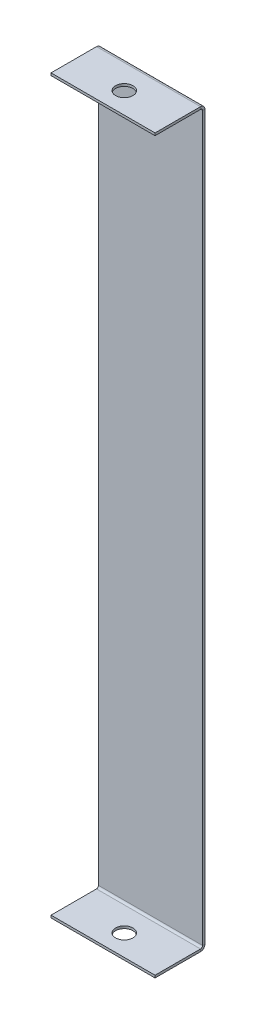
ISO-10303-21;
HEADER;
FILE_DESCRIPTION(('STEP AP214'),'2;1');
FILE_NAME('part.step','',(''),(''),'','','');
FILE_SCHEMA(('AUTOMOTIVE_DESIGN { 1 0 10303 214 1 1 1 1 }'));
ENDSEC;
DATA;
#1=APPLICATION_CONTEXT('core data for automotive mechanical design processes');
#2=APPLICATION_PROTOCOL_DEFINITION('international standard','automotive_design',2000,#1);
#3=PRODUCT_CONTEXT('',#1,'mechanical');
#4=PRODUCT('Part','Part','',(#3));
#5=PRODUCT_RELATED_PRODUCT_CATEGORY('part','',(#4));
#6=PRODUCT_DEFINITION_FORMATION('','',#4);
#7=PRODUCT_DEFINITION_CONTEXT('part definition',#1,'design');
#8=PRODUCT_DEFINITION('design','',#6,#7);
#9=PRODUCT_DEFINITION_SHAPE('','',#8);
#10=(LENGTH_UNIT() NAMED_UNIT(*) SI_UNIT(.MILLI.,.METRE.));
#11=(NAMED_UNIT(*) PLANE_ANGLE_UNIT() SI_UNIT($,.RADIAN.));
#12=(NAMED_UNIT(*) SI_UNIT($,.STERADIAN.) SOLID_ANGLE_UNIT());
#13=UNCERTAINTY_MEASURE_WITH_UNIT(LENGTH_MEASURE(1.E-05),#10,'distance_accuracy_value','');
#14=(GEOMETRIC_REPRESENTATION_CONTEXT(3) GLOBAL_UNCERTAINTY_ASSIGNED_CONTEXT((#13)) GLOBAL_UNIT_ASSIGNED_CONTEXT((#10,
#11,#12)) REPRESENTATION_CONTEXT('',''));
#15=CARTESIAN_POINT('',(0.,0.,0.));
#16=DIRECTION('',(0.,0.,1.));
#17=DIRECTION('',(1.,0.,0.));
#18=AXIS2_PLACEMENT_3D('',#15,#16,#17);
#19=CARTESIAN_POINT('',(0.,0.,-0.889));
#20=DIRECTION('',(0.,0.,-1.));
#21=DIRECTION('',(-1.,0.,0.));
#22=AXIS2_PLACEMENT_3D('',#19,#20,#21);
#23=PLANE('',#22);
#24=DIRECTION('',(0.,1.,0.));
#25=VECTOR('',#24,1.);
#26=CARTESIAN_POINT('',(19.05,-279.4,-0.889));
#27=LINE('',#26,#25);
#28=CARTESIAN_POINT('',(19.05,-132.422366229211,-0.889));
#29=VERTEX_POINT('',#28);
#30=CARTESIAN_POINT('',(19.05,132.422366229211,-0.889000000000002));
#31=VERTEX_POINT('',#30);
#32=EDGE_CURVE('E226',#29,#31,#27,.T.);
#33=ORIENTED_EDGE('',*,*,#32,.F.);
#34=DIRECTION('',(-1.,0.,0.));
#35=VECTOR('',#34,1.);
#36=CARTESIAN_POINT('',(0.,-132.422366229211,-0.889));
#37=LINE('',#36,#35);
#38=CARTESIAN_POINT('',(-19.05,-132.422366229211,-0.889));
#39=VERTEX_POINT('',#38);
#40=EDGE_CURVE('E251',#29,#39,#37,.T.);
#41=ORIENTED_EDGE('',*,*,#40,.T.);
#42=DIRECTION('',(0.,-1.,0.));
#43=VECTOR('',#42,1.);
#44=CARTESIAN_POINT('',(-19.05,-279.4,-0.889));
#45=LINE('',#44,#43);
#46=CARTESIAN_POINT('',(-19.05,132.422366229211,-0.889));
#47=VERTEX_POINT('',#46);
#48=EDGE_CURVE('E262',#47,#39,#45,.T.);
#49=ORIENTED_EDGE('',*,*,#48,.F.);
#50=DIRECTION('',(-1.,0.,0.));
#51=VECTOR('',#50,1.);
#52=CARTESIAN_POINT('',(0.,132.422366229211,-0.889));
#53=LINE('',#52,#51);
#54=EDGE_CURVE('E209',#31,#47,#53,.T.);
#55=ORIENTED_EDGE('',*,*,#54,.F.);
#56=EDGE_LOOP('',(#33,#41,#49,#55));
#57=FACE_BOUND('',#56,.T.);
#58=ADVANCED_FACE('F51',(#57),#23,.T.);
#59=CARTESIAN_POINT('',(19.05,-279.4,-0.889));
#60=DIRECTION('',(1.,0.,0.));
#61=DIRECTION('',(0.,0.,-1.));
#62=AXIS2_PLACEMENT_3D('',#59,#60,#61);
#63=PLANE('',#62);
#64=DIRECTION('',(0.,1.,0.));
#65=VECTOR('',#64,1.);
#66=CARTESIAN_POINT('',(19.05,-279.4,0.));
#67=LINE('',#66,#65);
#68=CARTESIAN_POINT('',(19.05,-132.422366229211,0.));
#69=VERTEX_POINT('',#68);
#70=CARTESIAN_POINT('',(19.05,132.422366229211,0.));
#71=VERTEX_POINT('',#70);
#72=EDGE_CURVE('E221',#69,#71,#67,.T.);
#73=ORIENTED_EDGE('',*,*,#72,.F.);
#74=DIRECTION('',(0.,0.,-1.));
#75=VECTOR('',#74,1.);
#76=CARTESIAN_POINT('',(19.05,-132.422366229211,-0.888999999998974));
#77=LINE('',#76,#75);
#78=EDGE_CURVE('E269',#69,#29,#77,.T.);
#79=ORIENTED_EDGE('',*,*,#78,.T.);
#80=ORIENTED_EDGE('',*,*,#32,.T.);
#81=DIRECTION('',(0.,0.,-1.));
#82=VECTOR('',#81,1.);
#83=CARTESIAN_POINT('',(19.05,132.422366229211,-0.888999999997124));
#84=LINE('',#83,#82);
#85=EDGE_CURVE('E222',#71,#31,#84,.T.);
#86=ORIENTED_EDGE('',*,*,#85,.F.);
#87=EDGE_LOOP('',(#73,#79,#80,#86));
#88=FACE_BOUND('',#87,.T.);
#89=ADVANCED_FACE('F289',(#88),#63,.T.);
#90=CARTESIAN_POINT('',(-19.05,-279.4,-0.889));
#91=DIRECTION('',(-1.,0.,0.));
#92=DIRECTION('',(0.,0.,1.));
#93=AXIS2_PLACEMENT_3D('',#90,#91,#92);
#94=PLANE('',#93);
#95=ORIENTED_EDGE('',*,*,#48,.T.);
#96=DIRECTION('',(0.,0.,1.));
#97=VECTOR('',#96,1.);
#98=CARTESIAN_POINT('',(-19.05,-132.422366229211,-0.888999999998974));
#99=LINE('',#98,#97);
#100=CARTESIAN_POINT('',(-19.05,-132.422366229211,0.));
#101=VERTEX_POINT('',#100);
#102=EDGE_CURVE('E12',#39,#101,#99,.T.);
#103=ORIENTED_EDGE('',*,*,#102,.T.);
#104=DIRECTION('',(0.,-1.,0.));
#105=VECTOR('',#104,1.);
#106=CARTESIAN_POINT('',(-19.05,-279.4,0.));
#107=LINE('',#106,#105);
#108=CARTESIAN_POINT('',(-19.05,132.422366229211,0.));
#109=VERTEX_POINT('',#108);
#110=EDGE_CURVE('E220',#109,#101,#107,.T.);
#111=ORIENTED_EDGE('',*,*,#110,.F.);
#112=DIRECTION('',(0.,0.,1.));
#113=VECTOR('',#112,1.);
#114=CARTESIAN_POINT('',(-19.05,132.422366229211,-0.888999999997124));
#115=LINE('',#114,#113);
#116=EDGE_CURVE('E227',#47,#109,#115,.T.);
#117=ORIENTED_EDGE('',*,*,#116,.F.);
#118=EDGE_LOOP('',(#95,#103,#111,#117));
#119=FACE_BOUND('',#118,.T.);
#120=ADVANCED_FACE('F53',(#119),#94,.T.);
#121=CARTESIAN_POINT('',(19.0499999999997,134.047966229213,-412.941033770789));
#122=DIRECTION('',(1.,0.,0.));
#123=DIRECTION('',(0.,1.,0.));
#124=AXIS2_PLACEMENT_3D('',#121,#122,#123);
#125=PLANE('',#124);
#126=DIRECTION('',(0.,1.,0.));
#127=VECTOR('',#126,1.);
#128=CARTESIAN_POINT('',(19.0500000000001,155.93325289737,17.399));
#129=LINE('',#128,#127);
#130=CARTESIAN_POINT('',(19.0500000000001,133.158966229211,17.399));
#131=VERTEX_POINT('',#130);
#132=CARTESIAN_POINT('',(19.0500000000001,134.047966229211,17.399));
#133=VERTEX_POINT('',#132);
#134=EDGE_CURVE('E160',#131,#133,#129,.T.);
#135=ORIENTED_EDGE('',*,*,#134,.F.);
#136=DIRECTION('',(0.,0.,1.));
#137=VECTOR('',#136,1.);
#138=CARTESIAN_POINT('',(19.0499999999997,133.158966229213,-412.941033770789));
#139=LINE('',#138,#137);
#140=CARTESIAN_POINT('',(19.05,133.158966229211,0.736600000000029));
#141=VERTEX_POINT('',#140);
#142=EDGE_CURVE('E258',#141,#131,#139,.T.);
#143=ORIENTED_EDGE('',*,*,#142,.F.);
#144=DIRECTION('',(0.,1.,0.));
#145=VECTOR('',#144,1.);
#146=CARTESIAN_POINT('',(19.05,134.047966229208,0.736600000000004));
#147=LINE('',#146,#145);
#148=CARTESIAN_POINT('',(19.05,134.047966229211,0.736600000000064));
#149=VERTEX_POINT('',#148);
#150=EDGE_CURVE('E238',#141,#149,#147,.T.);
#151=ORIENTED_EDGE('',*,*,#150,.T.);
#152=DIRECTION('',(0.,0.,1.));
#153=VECTOR('',#152,1.);
#154=CARTESIAN_POINT('',(19.0499999999997,134.047966229213,-412.941033770789));
#155=LINE('',#154,#153);
#156=EDGE_CURVE('E254',#149,#133,#155,.T.);
#157=ORIENTED_EDGE('',*,*,#156,.T.);
#158=EDGE_LOOP('',(#135,#143,#151,#157));
#159=FACE_BOUND('',#158,.T.);
#160=ADVANCED_FACE('F309',(#159),#125,.T.);
#161=CARTESIAN_POINT('',(-19.0500000000003,134.047966229213,-412.941033770789));
#162=DIRECTION('',(-1.,0.,0.));
#163=DIRECTION('',(0.,-1.,0.));
#164=AXIS2_PLACEMENT_3D('',#161,#162,#163);
#165=PLANE('',#164);
#166=DIRECTION('',(0.,1.,0.));
#167=VECTOR('',#166,1.);
#168=CARTESIAN_POINT('',(-19.0500000000001,155.93325289737,17.399));
#169=LINE('',#168,#167);
#170=CARTESIAN_POINT('',(-19.05,133.158966229211,17.399));
#171=VERTEX_POINT('',#170);
#172=CARTESIAN_POINT('',(-19.0500000000001,134.047966229211,17.399));
#173=VERTEX_POINT('',#172);
#174=EDGE_CURVE('E69',#171,#173,#169,.T.);
#175=ORIENTED_EDGE('',*,*,#174,.T.);
#176=DIRECTION('',(0.,0.,-1.));
#177=VECTOR('',#176,1.);
#178=CARTESIAN_POINT('',(-19.0500000000003,134.047966229213,-412.941033770789));
#179=LINE('',#178,#177);
#180=CARTESIAN_POINT('',(-19.05,134.047966229211,0.736600000000004));
#181=VERTEX_POINT('',#180);
#182=EDGE_CURVE('E239',#173,#181,#179,.T.);
#183=ORIENTED_EDGE('',*,*,#182,.T.);
#184=DIRECTION('',(0.,-1.,0.));
#185=VECTOR('',#184,1.);
#186=CARTESIAN_POINT('',(-19.05,134.047966229208,0.736600000000004));
#187=LINE('',#186,#185);
#188=CARTESIAN_POINT('',(-19.05,133.158966229211,0.736600000000029));
#189=VERTEX_POINT('',#188);
#190=EDGE_CURVE('E247',#181,#189,#187,.T.);
#191=ORIENTED_EDGE('',*,*,#190,.T.);
#192=DIRECTION('',(0.,0.,-1.));
#193=VECTOR('',#192,1.);
#194=CARTESIAN_POINT('',(-19.0500000000003,133.158966229213,-412.941033770789));
#195=LINE('',#194,#193);
#196=EDGE_CURVE('E255',#171,#189,#195,.T.);
#197=ORIENTED_EDGE('',*,*,#196,.F.);
#198=EDGE_LOOP('',(#175,#183,#191,#197));
#199=FACE_BOUND('',#198,.T.);
#200=ADVANCED_FACE('F390',(#199),#165,.T.);
#201=CARTESIAN_POINT('',(0.,134.047966229212,-133.541033770789));
#202=DIRECTION('',(0.,1.,0.));
#203=DIRECTION('',(-1.,0.,0.));
#204=AXIS2_PLACEMENT_3D('',#201,#202,#203);
#205=PLANE('',#204);
#206=CARTESIAN_POINT('',(0.,134.047966229211,9.62659999999907));
#207=DIRECTION('',(0.,-1.,0.));
#208=DIRECTION('',(0.,0.,-1.));
#209=AXIS2_PLACEMENT_3D('',#206,#207,#208);
#210=CIRCLE('',#209,3.175);
#211=CARTESIAN_POINT('',(0.,134.047966229211,6.45159999999907));
#212=VERTEX_POINT('',#211);
#213=EDGE_CURVE('E360',#212,#212,#210,.T.);
#214=ORIENTED_EDGE('',*,*,#213,.T.);
#215=EDGE_LOOP('',(#214));
#216=FACE_BOUND('',#215,.T.);
#217=DIRECTION('',(-1.,0.,0.));
#218=VECTOR('',#217,1.);
#219=CARTESIAN_POINT('',(0.,134.047966229211,17.399));
#220=LINE('',#219,#218);
#221=EDGE_CURVE('E182',#133,#173,#220,.T.);
#222=ORIENTED_EDGE('',*,*,#221,.F.);
#223=ORIENTED_EDGE('',*,*,#156,.F.);
#224=DIRECTION('',(-1.,0.,0.));
#225=VECTOR('',#224,1.);
#226=CARTESIAN_POINT('',(0.,134.047966229211,0.736599999999976));
#227=LINE('',#226,#225);
#228=EDGE_CURVE('E234',#149,#181,#227,.T.);
#229=ORIENTED_EDGE('',*,*,#228,.T.);
#230=ORIENTED_EDGE('',*,*,#182,.F.);
#231=EDGE_LOOP('',(#222,#223,#229,#230));
#232=FACE_BOUND('',#231,.T.);
#233=ADVANCED_FACE('F305',(#216,#232),#205,.T.);
#234=CARTESIAN_POINT('',(0.,133.158966229212,-133.541033770789));
#235=DIRECTION('',(0.,1.,0.));
#236=DIRECTION('',(-1.,0.,0.));
#237=AXIS2_PLACEMENT_3D('',#234,#235,#236);
#238=PLANE('',#237);
#239=CARTESIAN_POINT('',(0.,133.158966229211,9.62659999999907));
#240=DIRECTION('',(0.,1.,0.));
#241=DIRECTION('',(0.,0.,1.));
#242=AXIS2_PLACEMENT_3D('',#239,#240,#241);
#243=CIRCLE('',#242,3.175);
#244=CARTESIAN_POINT('',(0.,133.158966229211,12.8015999999991));
#245=VERTEX_POINT('',#244);
#246=EDGE_CURVE('E352',#245,#245,#243,.T.);
#247=ORIENTED_EDGE('',*,*,#246,.T.);
#248=EDGE_LOOP('',(#247));
#249=FACE_BOUND('',#248,.T.);
#250=ORIENTED_EDGE('',*,*,#142,.T.);
#251=DIRECTION('',(-1.,0.,0.));
#252=VECTOR('',#251,1.);
#253=CARTESIAN_POINT('',(0.,133.158966229211,17.399));
#254=LINE('',#253,#252);
#255=EDGE_CURVE('E345',#131,#171,#254,.T.);
#256=ORIENTED_EDGE('',*,*,#255,.T.);
#257=ORIENTED_EDGE('',*,*,#196,.T.);
#258=DIRECTION('',(-1.,0.,0.));
#259=VECTOR('',#258,1.);
#260=CARTESIAN_POINT('',(0.,133.158966229211,0.736599999999976));
#261=LINE('',#260,#259);
#262=EDGE_CURVE('E243',#141,#189,#261,.T.);
#263=ORIENTED_EDGE('',*,*,#262,.F.);
#264=EDGE_LOOP('',(#250,#256,#257,#263));
#265=FACE_BOUND('',#264,.T.);
#266=ADVANCED_FACE('F393',(#249,#265),#238,.F.);
#267=CARTESIAN_POINT('',(0.,0.,0.));
#268=DIRECTION('',(0.,0.,-1.));
#269=DIRECTION('',(-1.,0.,0.));
#270=AXIS2_PLACEMENT_3D('',#267,#268,#269);
#271=PLANE('',#270);
#272=DIRECTION('',(-1.,0.,0.));
#273=VECTOR('',#272,1.);
#274=CARTESIAN_POINT('',(0.,-132.422366229211,0.));
#275=LINE('',#274,#273);
#276=EDGE_CURVE('E61',#69,#101,#275,.T.);
#277=ORIENTED_EDGE('',*,*,#276,.F.);
#278=ORIENTED_EDGE('',*,*,#72,.T.);
#279=DIRECTION('',(-1.,0.,0.));
#280=VECTOR('',#279,1.);
#281=CARTESIAN_POINT('',(0.,132.422366229211,0.));
#282=LINE('',#281,#280);
#283=EDGE_CURVE('E216',#71,#109,#282,.T.);
#284=ORIENTED_EDGE('',*,*,#283,.T.);
#285=ORIENTED_EDGE('',*,*,#110,.T.);
#286=EDGE_LOOP('',(#277,#278,#284,#285));
#287=FACE_BOUND('',#286,.T.);
#288=ADVANCED_FACE('F316',(#287),#271,.F.);
#289=CARTESIAN_POINT('',(19.05,132.422366229211,0.7366));
#290=DIRECTION('',(1.,0.,0.));
#291=DIRECTION('',(0.,0.,-1.));
#292=AXIS2_PLACEMENT_3D('',#289,#290,#291);
#293=PLANE('',#292);
#294=ORIENTED_EDGE('',*,*,#150,.F.);
#295=CARTESIAN_POINT('',(19.05,132.422366229211,0.7366));
#296=DIRECTION('',(1.,0.,0.));
#297=DIRECTION('',(0.,1.,0.));
#298=AXIS2_PLACEMENT_3D('',#295,#296,#297);
#299=CIRCLE('',#298,0.7366);
#300=EDGE_CURVE('E192',#141,#71,#299,.F.);
#301=ORIENTED_EDGE('',*,*,#300,.T.);
#302=ORIENTED_EDGE('',*,*,#85,.T.);
#303=CARTESIAN_POINT('',(19.05,132.422366229211,0.7366));
#304=DIRECTION('',(-1.,0.,0.));
#305=DIRECTION('',(0.,0.,-1.));
#306=AXIS2_PLACEMENT_3D('',#303,#304,#305);
#307=CIRCLE('',#306,1.6256);
#308=EDGE_CURVE('E200',#149,#31,#307,.T.);
#309=ORIENTED_EDGE('',*,*,#308,.F.);
#310=EDGE_LOOP('',(#294,#301,#302,#309));
#311=FACE_BOUND('',#310,.T.);
#312=ADVANCED_FACE('F297',(#311),#293,.T.);
#313=CARTESIAN_POINT('',(-19.05,132.422366229211,0.7366));
#314=DIRECTION('',(-1.,0.,0.));
#315=DIRECTION('',(0.,0.,1.));
#316=AXIS2_PLACEMENT_3D('',#313,#314,#315);
#317=PLANE('',#316);
#318=CARTESIAN_POINT('',(-19.05,132.422366229211,0.7366));
#319=DIRECTION('',(1.,0.,0.));
#320=DIRECTION('',(0.,1.,0.));
#321=AXIS2_PLACEMENT_3D('',#318,#319,#320);
#322=CIRCLE('',#321,0.7366);
#323=EDGE_CURVE('E205',#109,#189,#322,.T.);
#324=ORIENTED_EDGE('',*,*,#323,.T.);
#325=ORIENTED_EDGE('',*,*,#190,.F.);
#326=CARTESIAN_POINT('',(-19.05,132.422366229211,0.7366));
#327=DIRECTION('',(1.,0.,0.));
#328=DIRECTION('',(0.,0.,1.));
#329=AXIS2_PLACEMENT_3D('',#326,#327,#328);
#330=CIRCLE('',#329,1.62560000000002);
#331=EDGE_CURVE('E204',#47,#181,#330,.T.);
#332=ORIENTED_EDGE('',*,*,#331,.F.);
#333=ORIENTED_EDGE('',*,*,#116,.T.);
#334=EDGE_LOOP('',(#324,#325,#332,#333));
#335=FACE_BOUND('',#334,.T.);
#336=ADVANCED_FACE('F318',(#335),#317,.T.);
#337=CARTESIAN_POINT('',(-38.1555020757273,132.422366229211,0.7366));
#338=DIRECTION('',(1.,0.,0.));
#339=DIRECTION('',(0.,1.,0.));
#340=AXIS2_PLACEMENT_3D('',#337,#338,#339);
#341=CYLINDRICAL_SURFACE('',#340,1.6256);
#342=ORIENTED_EDGE('',*,*,#54,.T.);
#343=ORIENTED_EDGE('',*,*,#331,.T.);
#344=ORIENTED_EDGE('',*,*,#228,.F.);
#345=ORIENTED_EDGE('',*,*,#308,.T.);
#346=EDGE_LOOP('',(#342,#343,#344,#345));
#347=FACE_BOUND('',#346,.T.);
#348=ADVANCED_FACE('F300',(#347),#341,.T.);
#349=CARTESIAN_POINT('',(-38.1555020757273,132.422366229211,0.7366));
#350=DIRECTION('',(1.,0.,0.));
#351=DIRECTION('',(0.,1.,0.));
#352=AXIS2_PLACEMENT_3D('',#349,#350,#351);
#353=CYLINDRICAL_SURFACE('',#352,0.7366);
#354=ORIENTED_EDGE('',*,*,#283,.F.);
#355=ORIENTED_EDGE('',*,*,#300,.F.);
#356=ORIENTED_EDGE('',*,*,#262,.T.);
#357=ORIENTED_EDGE('',*,*,#323,.F.);
#358=EDGE_LOOP('',(#354,#355,#356,#357));
#359=FACE_BOUND('',#358,.T.);
#360=ADVANCED_FACE('F312',(#359),#353,.F.);
#361=CARTESIAN_POINT('',(19.05,-132.422366229211,0.7366));
#362=DIRECTION('',(1.,0.,0.));
#363=DIRECTION('',(0.,0.,-1.));
#364=AXIS2_PLACEMENT_3D('',#361,#362,#363);
#365=PLANE('',#364);
#366=ORIENTED_EDGE('',*,*,#78,.F.);
#367=CARTESIAN_POINT('',(19.05,-132.422366229211,0.7366));
#368=DIRECTION('',(-1.,0.,0.));
#369=DIRECTION('',(0.,-1.,0.));
#370=AXIS2_PLACEMENT_3D('',#367,#368,#369);
#371=CIRCLE('',#370,0.7366);
#372=CARTESIAN_POINT('',(19.05,-133.158966229211,0.736600000000004));
#373=VERTEX_POINT('',#372);
#374=EDGE_CURVE('E193',#69,#373,#371,.T.);
#375=ORIENTED_EDGE('',*,*,#374,.T.);
#376=DIRECTION('',(0.,-1.,0.));
#377=VECTOR('',#376,1.);
#378=CARTESIAN_POINT('',(19.05,-134.04796622921,0.736600000000004));
#379=LINE('',#378,#377);
#380=CARTESIAN_POINT('',(19.05,-134.047966229211,0.736600000000004));
#381=VERTEX_POINT('',#380);
#382=EDGE_CURVE('E167',#373,#381,#379,.T.);
#383=ORIENTED_EDGE('',*,*,#382,.T.);
#384=CARTESIAN_POINT('',(19.05,-132.422366229211,0.7366));
#385=DIRECTION('',(-1.,0.,0.));
#386=DIRECTION('',(0.,0.,-1.));
#387=AXIS2_PLACEMENT_3D('',#384,#385,#386);
#388=CIRCLE('',#387,1.62560000000002);
#389=EDGE_CURVE('E183',#29,#381,#388,.T.);
#390=ORIENTED_EDGE('',*,*,#389,.F.);
#391=EDGE_LOOP('',(#366,#375,#383,#390));
#392=FACE_BOUND('',#391,.T.);
#393=ADVANCED_FACE('F328',(#392),#365,.T.);
#394=CARTESIAN_POINT('',(-19.05,-132.422366229211,0.7366));
#395=DIRECTION('',(-1.,0.,0.));
#396=DIRECTION('',(0.,0.,1.));
#397=AXIS2_PLACEMENT_3D('',#394,#395,#396);
#398=PLANE('',#397);
#399=CARTESIAN_POINT('',(-19.05,-132.422366229211,0.7366));
#400=DIRECTION('',(-1.,0.,0.));
#401=DIRECTION('',(0.,-1.,0.));
#402=AXIS2_PLACEMENT_3D('',#399,#400,#401);
#403=CIRCLE('',#402,0.7366);
#404=CARTESIAN_POINT('',(-19.05,-133.158966229211,0.736600000000004));
#405=VERTEX_POINT('',#404);
#406=EDGE_CURVE('E188',#405,#101,#403,.F.);
#407=ORIENTED_EDGE('',*,*,#406,.T.);
#408=ORIENTED_EDGE('',*,*,#102,.F.);
#409=CARTESIAN_POINT('',(-19.05,-132.422366229211,0.7366));
#410=DIRECTION('',(1.,0.,0.));
#411=DIRECTION('',(0.,0.,1.));
#412=AXIS2_PLACEMENT_3D('',#409,#410,#411);
#413=CIRCLE('',#412,1.6256);
#414=CARTESIAN_POINT('',(-19.05,-134.047966229211,0.736600000000026));
#415=VERTEX_POINT('',#414);
#416=EDGE_CURVE('E187',#415,#39,#413,.T.);
#417=ORIENTED_EDGE('',*,*,#416,.F.);
#418=DIRECTION('',(0.,1.,0.));
#419=VECTOR('',#418,1.);
#420=CARTESIAN_POINT('',(-19.05,-134.04796622921,0.736600000000004));
#421=LINE('',#420,#419);
#422=EDGE_CURVE('E173',#415,#405,#421,.T.);
#423=ORIENTED_EDGE('',*,*,#422,.T.);
#424=EDGE_LOOP('',(#407,#408,#417,#423));
#425=FACE_BOUND('',#424,.T.);
#426=ADVANCED_FACE('F322',(#425),#398,.T.);
#427=CARTESIAN_POINT('',(38.1555020757273,-132.422366229211,0.7366));
#428=DIRECTION('',(-1.,0.,0.));
#429=DIRECTION('',(0.,-1.,0.));
#430=AXIS2_PLACEMENT_3D('',#427,#428,#429);
#431=CYLINDRICAL_SURFACE('',#430,1.6256);
#432=DIRECTION('',(-1.,0.,0.));
#433=VECTOR('',#432,1.);
#434=CARTESIAN_POINT('',(0.,-134.047966229211,0.736600000000004));
#435=LINE('',#434,#433);
#436=EDGE_CURVE('E164',#381,#415,#435,.T.);
#437=ORIENTED_EDGE('',*,*,#436,.T.);
#438=ORIENTED_EDGE('',*,*,#416,.T.);
#439=ORIENTED_EDGE('',*,*,#40,.F.);
#440=ORIENTED_EDGE('',*,*,#389,.T.);
#441=EDGE_LOOP('',(#437,#438,#439,#440));
#442=FACE_BOUND('',#441,.T.);
#443=ADVANCED_FACE('F325',(#442),#431,.T.);
#444=CARTESIAN_POINT('',(38.1555020757273,-132.422366229211,0.7366));
#445=DIRECTION('',(-1.,0.,0.));
#446=DIRECTION('',(0.,-1.,0.));
#447=AXIS2_PLACEMENT_3D('',#444,#445,#446);
#448=CYLINDRICAL_SURFACE('',#447,0.7366);
#449=DIRECTION('',(-1.,0.,0.));
#450=VECTOR('',#449,1.);
#451=CARTESIAN_POINT('',(0.,-133.158966229211,0.736600000000004));
#452=LINE('',#451,#450);
#453=EDGE_CURVE('E171',#373,#405,#452,.T.);
#454=ORIENTED_EDGE('',*,*,#453,.F.);
#455=ORIENTED_EDGE('',*,*,#374,.F.);
#456=ORIENTED_EDGE('',*,*,#276,.T.);
#457=ORIENTED_EDGE('',*,*,#406,.F.);
#458=EDGE_LOOP('',(#454,#455,#456,#457));
#459=FACE_BOUND('',#458,.T.);
#460=ADVANCED_FACE('F333',(#459),#448,.F.);
#461=CARTESIAN_POINT('',(0.,-134.047966229212,-133.541033770789));
#462=DIRECTION('',(0.,-1.,0.));
#463=DIRECTION('',(-1.,0.,0.));
#464=AXIS2_PLACEMENT_3D('',#461,#462,#463);
#465=PLANE('',#464);
#466=CARTESIAN_POINT('',(1.63572470113264E-13,-134.047966229211,9.6266));
#467=DIRECTION('',(0.,-1.,0.));
#468=DIRECTION('',(0.,0.,-1.));
#469=AXIS2_PLACEMENT_3D('',#466,#467,#468);
#470=CIRCLE('',#469,3.175);
#471=CARTESIAN_POINT('',(1.63572470113264E-13,-134.047966229211,6.4516));
#472=VERTEX_POINT('',#471);
#473=EDGE_CURVE('E356',#472,#472,#470,.T.);
#474=ORIENTED_EDGE('',*,*,#473,.F.);
#475=EDGE_LOOP('',(#474));
#476=FACE_BOUND('',#475,.T.);
#477=DIRECTION('',(1.,0.,0.));
#478=VECTOR('',#477,1.);
#479=CARTESIAN_POINT('',(-19.0500000000001,-134.047966229211,17.399));
#480=LINE('',#479,#478);
#481=CARTESIAN_POINT('',(-19.0500000000001,-134.047966229211,17.399));
#482=VERTEX_POINT('',#481);
#483=CARTESIAN_POINT('',(19.0500000000001,-134.047966229211,17.399));
#484=VERTEX_POINT('',#483);
#485=EDGE_CURVE('E141',#482,#484,#480,.T.);
#486=ORIENTED_EDGE('',*,*,#485,.F.);
#487=DIRECTION('',(0.,0.,1.));
#488=VECTOR('',#487,1.);
#489=CARTESIAN_POINT('',(-19.0500000000001,-134.047966229211,145.858966229211));
#490=LINE('',#489,#488);
#491=EDGE_CURVE('E197',#415,#482,#490,.T.);
#492=ORIENTED_EDGE('',*,*,#491,.F.);
#493=ORIENTED_EDGE('',*,*,#436,.F.);
#494=DIRECTION('',(0.,0.,-1.));
#495=VECTOR('',#494,1.);
#496=CARTESIAN_POINT('',(19.0499999999999,-134.047966229211,145.858966229211));
#497=LINE('',#496,#495);
#498=EDGE_CURVE('E156',#484,#381,#497,.T.);
#499=ORIENTED_EDGE('',*,*,#498,.F.);
#500=EDGE_LOOP('',(#486,#492,#493,#499));
#501=FACE_BOUND('',#500,.T.);
#502=ADVANCED_FACE('F162',(#476,#501),#465,.T.);
#503=CARTESIAN_POINT('',(19.0499999999999,-134.047966229211,145.858966229211));
#504=DIRECTION('',(1.,0.,0.));
#505=DIRECTION('',(0.,-1.,0.));
#506=AXIS2_PLACEMENT_3D('',#503,#504,#505);
#507=PLANE('',#506);
#508=CARTESIAN_POINT('',(19.0500000000001,-133.158966229211,17.399));
#509=VERTEX_POINT('',#508);
#510=EDGE_CURVE('E144',#484,#509,#129,.T.);
#511=ORIENTED_EDGE('',*,*,#510,.F.);
#512=ORIENTED_EDGE('',*,*,#498,.T.);
#513=ORIENTED_EDGE('',*,*,#382,.F.);
#514=DIRECTION('',(0.,0.,-1.));
#515=VECTOR('',#514,1.);
#516=CARTESIAN_POINT('',(19.0499999999999,-133.158966229211,145.858966229211));
#517=LINE('',#516,#515);
#518=EDGE_CURVE('E158',#509,#373,#517,.T.);
#519=ORIENTED_EDGE('',*,*,#518,.F.);
#520=EDGE_LOOP('',(#511,#512,#513,#519));
#521=FACE_BOUND('',#520,.T.);
#522=ADVANCED_FACE('F154',(#521),#507,.T.);
#523=CARTESIAN_POINT('',(0.,-133.158966229212,-133.541033770789));
#524=DIRECTION('',(0.,-1.,0.));
#525=DIRECTION('',(-1.,0.,0.));
#526=AXIS2_PLACEMENT_3D('',#523,#524,#525);
#527=PLANE('',#526);
#528=CARTESIAN_POINT('',(1.62924840015566E-13,-133.158966229211,9.6266));
#529=DIRECTION('',(0.,-1.,0.));
#530=DIRECTION('',(0.,0.,-1.));
#531=AXIS2_PLACEMENT_3D('',#528,#529,#530);
#532=CIRCLE('',#531,3.175);
#533=CARTESIAN_POINT('',(1.62924840015566E-13,-133.158966229211,6.4516));
#534=VERTEX_POINT('',#533);
#535=EDGE_CURVE('E55',#534,#534,#532,.T.);
#536=ORIENTED_EDGE('',*,*,#535,.T.);
#537=EDGE_LOOP('',(#536));
#538=FACE_BOUND('',#537,.T.);
#539=DIRECTION('',(0.,0.,1.));
#540=VECTOR('',#539,1.);
#541=CARTESIAN_POINT('',(-19.0500000000001,-133.158966229211,145.858966229211));
#542=LINE('',#541,#540);
#543=CARTESIAN_POINT('',(-19.05,-133.158966229211,17.399));
#544=VERTEX_POINT('',#543);
#545=EDGE_CURVE('E337',#405,#544,#542,.T.);
#546=ORIENTED_EDGE('',*,*,#545,.T.);
#547=DIRECTION('',(1.,0.,0.));
#548=VECTOR('',#547,1.);
#549=CARTESIAN_POINT('',(0.,-133.158966229211,17.399));
#550=LINE('',#549,#548);
#551=EDGE_CURVE('E77',#544,#509,#550,.T.);
#552=ORIENTED_EDGE('',*,*,#551,.T.);
#553=ORIENTED_EDGE('',*,*,#518,.T.);
#554=ORIENTED_EDGE('',*,*,#453,.T.);
#555=EDGE_LOOP('',(#546,#552,#553,#554));
#556=FACE_BOUND('',#555,.T.);
#557=ADVANCED_FACE('F369',(#538,#556),#527,.F.);
#558=CARTESIAN_POINT('',(-19.0500000000001,-134.047966229211,145.858966229211));
#559=DIRECTION('',(-1.,0.,0.));
#560=DIRECTION('',(0.,1.,0.));
#561=AXIS2_PLACEMENT_3D('',#558,#559,#560);
#562=PLANE('',#561);
#563=EDGE_CURVE('E145',#482,#544,#169,.T.);
#564=ORIENTED_EDGE('',*,*,#563,.T.);
#565=ORIENTED_EDGE('',*,*,#545,.F.);
#566=ORIENTED_EDGE('',*,*,#422,.F.);
#567=ORIENTED_EDGE('',*,*,#491,.T.);
#568=EDGE_LOOP('',(#564,#565,#566,#567));
#569=FACE_BOUND('',#568,.T.);
#570=ADVANCED_FACE('F422',(#569),#562,.T.);
#571=CARTESIAN_POINT('',(-19.0500000000001,155.93325289737,17.399));
#572=DIRECTION('',(0.,0.,-1.));
#573=DIRECTION('',(0.,1.,0.));
#574=AXIS2_PLACEMENT_3D('',#571,#572,#573);
#575=PLANE('',#574);
#576=ORIENTED_EDGE('',*,*,#563,.F.);
#577=ORIENTED_EDGE('',*,*,#485,.T.);
#578=ORIENTED_EDGE('',*,*,#510,.T.);
#579=ORIENTED_EDGE('',*,*,#551,.F.);
#580=EDGE_LOOP('',(#576,#577,#578,#579));
#581=FACE_BOUND('',#580,.T.);
#582=ADVANCED_FACE('F143',(#581),#575,.F.);
#583=ORIENTED_EDGE('',*,*,#221,.T.);
#584=ORIENTED_EDGE('',*,*,#174,.F.);
#585=ORIENTED_EDGE('',*,*,#255,.F.);
#586=ORIENTED_EDGE('',*,*,#134,.T.);
#587=EDGE_LOOP('',(#583,#584,#585,#586));
#588=FACE_BOUND('',#587,.T.);
#589=ADVANCED_FACE('F374',(#588),#575,.F.);
#590=CARTESIAN_POINT('',(0.,134.047966229211,9.62659999999907));
#591=DIRECTION('',(0.,-1.,0.));
#592=DIRECTION('',(0.,0.,-1.));
#593=AXIS2_PLACEMENT_3D('',#590,#591,#592);
#594=CYLINDRICAL_SURFACE('',#593,3.175);
#595=ORIENTED_EDGE('',*,*,#473,.T.);
#596=EDGE_LOOP('',(#595));
#597=FACE_BOUND('',#596,.T.);
#598=ORIENTED_EDGE('',*,*,#535,.F.);
#599=EDGE_LOOP('',(#598));
#600=FACE_BOUND('',#599,.T.);
#601=ADVANCED_FACE('F371',(#597,#600),#594,.F.);
#602=ORIENTED_EDGE('',*,*,#213,.F.);
#603=EDGE_LOOP('',(#602));
#604=FACE_BOUND('',#603,.T.);
#605=ORIENTED_EDGE('',*,*,#246,.F.);
#606=EDGE_LOOP('',(#605));
#607=FACE_BOUND('',#606,.T.);
#608=ADVANCED_FACE('F373',(#604,#607),#594,.F.);
#609=CLOSED_SHELL('',(#58,#89,#120,#160,#200,#233,#266,#288,#312,#336,#348,#360,#393,#426,#443,
#460,#502,#522,#557,#570,#582,#589,#601,#608));
#610=MANIFOLD_SOLID_BREP('B2',#609);
#611=ADVANCED_BREP_SHAPE_REPRESENTATION('',(#18,#610),#14);
#612=SHAPE_DEFINITION_REPRESENTATION(#9,#611);
ENDSEC;
END-ISO-10303-21;
